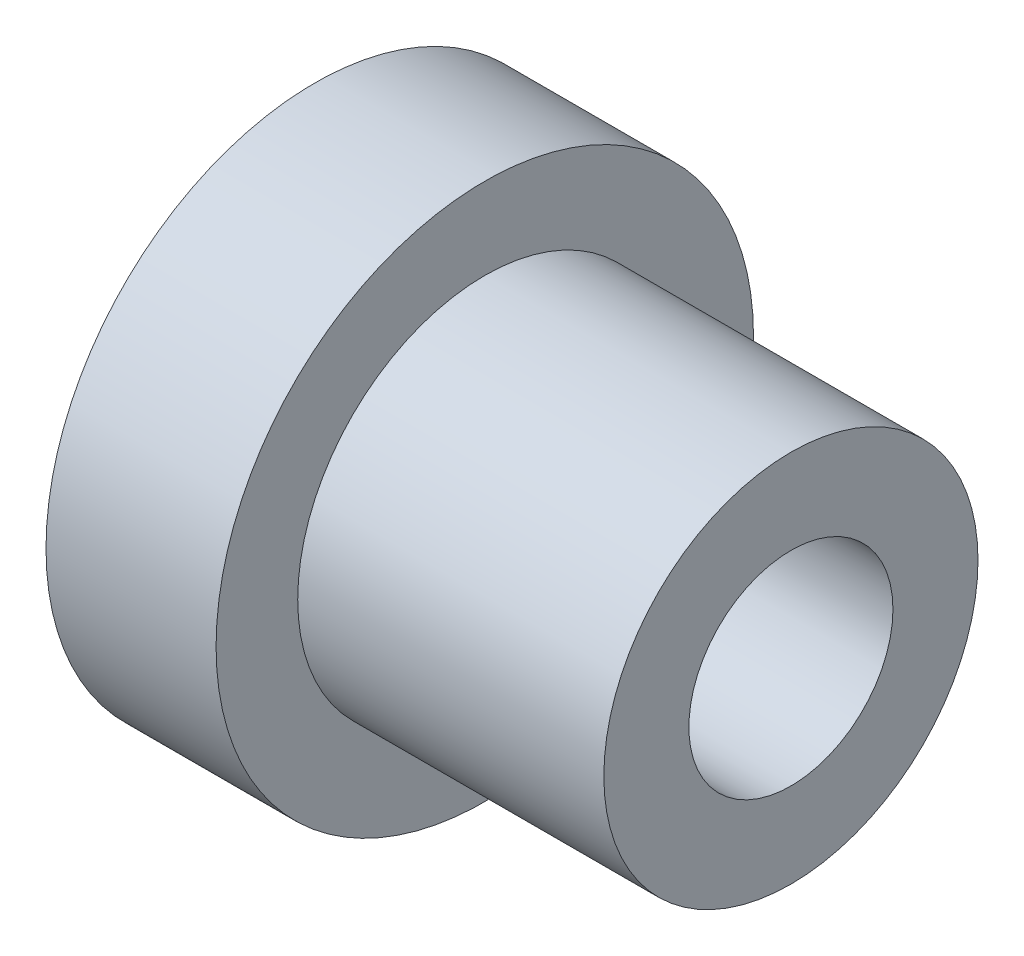
ISO-10303-21;
HEADER;
FILE_DESCRIPTION(('STEP AP214'),'2;1');
FILE_NAME('part.step','',(''),(''),'','','');
FILE_SCHEMA(('AUTOMOTIVE_DESIGN { 1 0 10303 214 1 1 1 1 }'));
ENDSEC;
DATA;
#1=APPLICATION_CONTEXT('core data for automotive mechanical design processes');
#2=APPLICATION_PROTOCOL_DEFINITION('international standard','automotive_design',2000,#1);
#3=PRODUCT_CONTEXT('',#1,'mechanical');
#4=PRODUCT('Part','Part','',(#3));
#5=PRODUCT_RELATED_PRODUCT_CATEGORY('part','',(#4));
#6=PRODUCT_DEFINITION_FORMATION('','',#4);
#7=PRODUCT_DEFINITION_CONTEXT('part definition',#1,'design');
#8=PRODUCT_DEFINITION('design','',#6,#7);
#9=PRODUCT_DEFINITION_SHAPE('','',#8);
#10=(LENGTH_UNIT() NAMED_UNIT(*) SI_UNIT(.MILLI.,.METRE.));
#11=(NAMED_UNIT(*) PLANE_ANGLE_UNIT() SI_UNIT($,.RADIAN.));
#12=(NAMED_UNIT(*) SI_UNIT($,.STERADIAN.) SOLID_ANGLE_UNIT());
#13=UNCERTAINTY_MEASURE_WITH_UNIT(LENGTH_MEASURE(1.E-05),#10,'distance_accuracy_value','');
#14=(GEOMETRIC_REPRESENTATION_CONTEXT(3) GLOBAL_UNCERTAINTY_ASSIGNED_CONTEXT((#13)) GLOBAL_UNIT_ASSIGNED_CONTEXT((#10,
#11,#12)) REPRESENTATION_CONTEXT('',''));
#15=CARTESIAN_POINT('',(0.,0.,0.));
#16=DIRECTION('',(0.,0.,1.));
#17=DIRECTION('',(1.,0.,0.));
#18=AXIS2_PLACEMENT_3D('',#15,#16,#17);
#19=CARTESIAN_POINT('',(-7.85,0.1,0.));
#20=DIRECTION('',(1.,0.,0.));
#21=DIRECTION('',(0.,0.,-1.));
#22=AXIS2_PLACEMENT_3D('',#19,#20,#21);
#23=CYLINDRICAL_SURFACE('',#22,5.5);
#24=CARTESIAN_POINT('',(-2.85,0.1,0.));
#25=DIRECTION('',(1.,0.,0.));
#26=DIRECTION('',(0.,0.,-1.));
#27=AXIS2_PLACEMENT_3D('',#24,#25,#26);
#28=CIRCLE('',#27,5.5);
#29=CARTESIAN_POINT('',(-2.85,0.1,-5.5));
#30=VERTEX_POINT('',#29);
#31=EDGE_CURVE('E58',#30,#30,#28,.T.);
#32=ORIENTED_EDGE('',*,*,#31,.T.);
#33=EDGE_LOOP('',(#32));
#34=FACE_BOUND('',#33,.T.);
#35=CARTESIAN_POINT('',(6.15,0.1,0.));
#36=DIRECTION('',(1.,0.,0.));
#37=DIRECTION('',(0.,0.,-1.));
#38=AXIS2_PLACEMENT_3D('',#35,#36,#37);
#39=CIRCLE('',#38,5.5);
#40=CARTESIAN_POINT('',(6.15,0.1,-5.5));
#41=VERTEX_POINT('',#40);
#42=EDGE_CURVE('E10',#41,#41,#39,.T.);
#43=ORIENTED_EDGE('',*,*,#42,.F.);
#44=EDGE_LOOP('',(#43));
#45=FACE_BOUND('',#44,.T.);
#46=ADVANCED_FACE('F30',(#34,#45),#23,.T.);
#47=CARTESIAN_POINT('',(6.15,3.1,0.));
#48=DIRECTION('',(1.,0.,0.));
#49=DIRECTION('',(0.,0.,-1.));
#50=AXIS2_PLACEMENT_3D('',#47,#48,#49);
#51=PLANE('',#50);
#52=ORIENTED_EDGE('',*,*,#42,.T.);
#53=EDGE_LOOP('',(#52));
#54=FACE_BOUND('',#53,.T.);
#55=CARTESIAN_POINT('',(6.15,0.1,0.));
#56=DIRECTION('',(1.,0.,0.));
#57=DIRECTION('',(0.,0.,-1.));
#58=AXIS2_PLACEMENT_3D('',#55,#56,#57);
#59=CIRCLE('',#58,3.);
#60=CARTESIAN_POINT('',(6.15,0.1,-3.));
#61=VERTEX_POINT('',#60);
#62=EDGE_CURVE('E36',#61,#61,#59,.T.);
#63=ORIENTED_EDGE('',*,*,#62,.F.);
#64=EDGE_LOOP('',(#63));
#65=FACE_BOUND('',#64,.T.);
#66=ADVANCED_FACE('F76',(#54,#65),#51,.T.);
#67=CARTESIAN_POINT('',(-7.85,0.1,0.));
#68=DIRECTION('',(1.,0.,0.));
#69=DIRECTION('',(0.,0.,-1.));
#70=AXIS2_PLACEMENT_3D('',#67,#68,#69);
#71=CYLINDRICAL_SURFACE('',#70,3.);
#72=ORIENTED_EDGE('',*,*,#62,.T.);
#73=EDGE_LOOP('',(#72));
#74=FACE_BOUND('',#73,.T.);
#75=CARTESIAN_POINT('',(-5.35,0.1,0.));
#76=DIRECTION('',(1.,0.,0.));
#77=DIRECTION('',(0.,0.,-1.));
#78=AXIS2_PLACEMENT_3D('',#75,#76,#77);
#79=CIRCLE('',#78,3.);
#80=CARTESIAN_POINT('',(-5.35,0.1,-3.));
#81=VERTEX_POINT('',#80);
#82=EDGE_CURVE('E40',#81,#81,#79,.T.);
#83=ORIENTED_EDGE('',*,*,#82,.F.);
#84=EDGE_LOOP('',(#83));
#85=FACE_BOUND('',#84,.T.);
#86=ADVANCED_FACE('F80',(#74,#85),#71,.F.);
#87=CARTESIAN_POINT('',(-5.35,6.,0.));
#88=DIRECTION('',(-1.,0.,0.));
#89=DIRECTION('',(0.,0.,1.));
#90=AXIS2_PLACEMENT_3D('',#87,#88,#89);
#91=PLANE('',#90);
#92=ORIENTED_EDGE('',*,*,#82,.T.);
#93=EDGE_LOOP('',(#92));
#94=FACE_BOUND('',#93,.T.);
#95=CARTESIAN_POINT('',(-5.35,0.1,0.));
#96=DIRECTION('',(1.,0.,0.));
#97=DIRECTION('',(0.,0.,-1.));
#98=AXIS2_PLACEMENT_3D('',#95,#96,#97);
#99=CIRCLE('',#98,5.9);
#100=CARTESIAN_POINT('',(-5.35,0.1,-5.9));
#101=VERTEX_POINT('',#100);
#102=EDGE_CURVE('E44',#101,#101,#99,.T.);
#103=ORIENTED_EDGE('',*,*,#102,.F.);
#104=EDGE_LOOP('',(#103));
#105=FACE_BOUND('',#104,.T.);
#106=ADVANCED_FACE('F84',(#94,#105),#91,.T.);
#107=CARTESIAN_POINT('',(-7.85,0.1,0.));
#108=DIRECTION('',(1.,0.,0.));
#109=DIRECTION('',(0.,0.,-1.));
#110=AXIS2_PLACEMENT_3D('',#107,#108,#109);
#111=CYLINDRICAL_SURFACE('',#110,5.9);
#112=ORIENTED_EDGE('',*,*,#102,.T.);
#113=EDGE_LOOP('',(#112));
#114=FACE_BOUND('',#113,.T.);
#115=CARTESIAN_POINT('',(-7.85,0.1,0.));
#116=DIRECTION('',(1.,0.,0.));
#117=DIRECTION('',(0.,0.,-1.));
#118=AXIS2_PLACEMENT_3D('',#115,#116,#117);
#119=CIRCLE('',#118,5.9);
#120=CARTESIAN_POINT('',(-7.85,0.1,-5.9));
#121=VERTEX_POINT('',#120);
#122=EDGE_CURVE('E49',#121,#121,#119,.T.);
#123=ORIENTED_EDGE('',*,*,#122,.F.);
#124=EDGE_LOOP('',(#123));
#125=FACE_BOUND('',#124,.T.);
#126=ADVANCED_FACE('F90',(#114,#125),#111,.F.);
#127=CARTESIAN_POINT('',(-7.85,8.,0.));
#128=DIRECTION('',(-1.,0.,0.));
#129=DIRECTION('',(0.,0.,1.));
#130=AXIS2_PLACEMENT_3D('',#127,#128,#129);
#131=PLANE('',#130);
#132=ORIENTED_EDGE('',*,*,#122,.T.);
#133=EDGE_LOOP('',(#132));
#134=FACE_BOUND('',#133,.T.);
#135=CARTESIAN_POINT('',(-7.85,0.1,0.));
#136=DIRECTION('',(1.,0.,0.));
#137=DIRECTION('',(0.,0.,-1.));
#138=AXIS2_PLACEMENT_3D('',#135,#136,#137);
#139=CIRCLE('',#138,7.9);
#140=CARTESIAN_POINT('',(-7.85,0.1,-7.9));
#141=VERTEX_POINT('',#140);
#142=EDGE_CURVE('E52',#141,#141,#139,.T.);
#143=ORIENTED_EDGE('',*,*,#142,.F.);
#144=EDGE_LOOP('',(#143));
#145=FACE_BOUND('',#144,.T.);
#146=ADVANCED_FACE('F72',(#134,#145),#131,.T.);
#147=CARTESIAN_POINT('',(-7.85,0.1,0.));
#148=DIRECTION('',(1.,0.,0.));
#149=DIRECTION('',(0.,0.,-1.));
#150=AXIS2_PLACEMENT_3D('',#147,#148,#149);
#151=CYLINDRICAL_SURFACE('',#150,7.9);
#152=ORIENTED_EDGE('',*,*,#142,.T.);
#153=EDGE_LOOP('',(#152));
#154=FACE_BOUND('',#153,.T.);
#155=CARTESIAN_POINT('',(-2.85,0.1,0.));
#156=DIRECTION('',(1.,0.,0.));
#157=DIRECTION('',(0.,0.,-1.));
#158=AXIS2_PLACEMENT_3D('',#155,#156,#157);
#159=CIRCLE('',#158,7.9);
#160=CARTESIAN_POINT('',(-2.85,0.1,-7.9));
#161=VERTEX_POINT('',#160);
#162=EDGE_CURVE('E55',#161,#161,#159,.T.);
#163=ORIENTED_EDGE('',*,*,#162,.F.);
#164=EDGE_LOOP('',(#163));
#165=FACE_BOUND('',#164,.T.);
#166=ADVANCED_FACE('F66',(#154,#165),#151,.T.);
#167=CARTESIAN_POINT('',(-2.85,5.6,0.));
#168=DIRECTION('',(1.,0.,0.));
#169=DIRECTION('',(0.,0.,-1.));
#170=AXIS2_PLACEMENT_3D('',#167,#168,#169);
#171=PLANE('',#170);
#172=ORIENTED_EDGE('',*,*,#162,.T.);
#173=EDGE_LOOP('',(#172));
#174=FACE_BOUND('',#173,.T.);
#175=ORIENTED_EDGE('',*,*,#31,.F.);
#176=EDGE_LOOP('',(#175));
#177=FACE_BOUND('',#176,.T.);
#178=ADVANCED_FACE('F64',(#174,#177),#171,.T.);
#179=CLOSED_SHELL('',(#46,#66,#86,#106,#126,#146,#166,#178));
#180=MANIFOLD_SOLID_BREP('B2',#179);
#181=ADVANCED_BREP_SHAPE_REPRESENTATION('',(#18,#180),#14);
#182=SHAPE_DEFINITION_REPRESENTATION(#9,#181);
ENDSEC;
END-ISO-10303-21;
